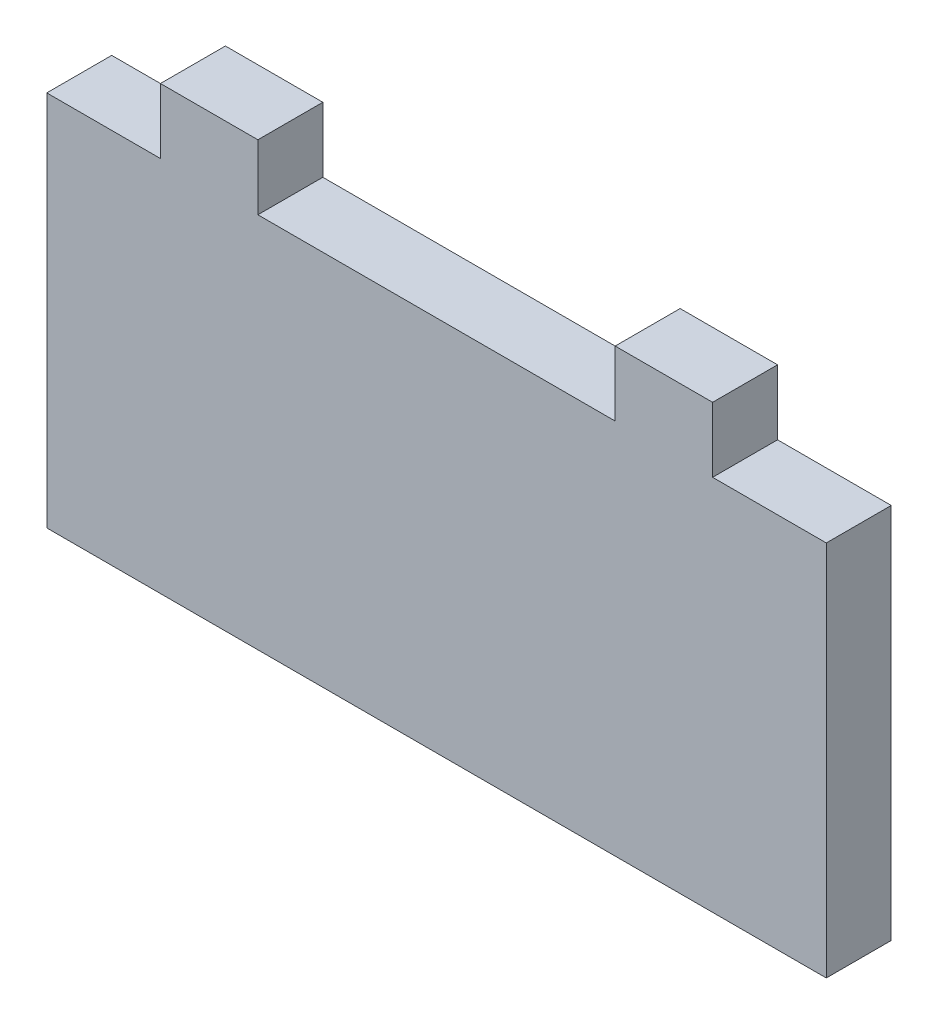
ISO-10303-21;
HEADER;
FILE_DESCRIPTION(('STEP AP214'),'2;1');
FILE_NAME('part.step','',(''),(''),'','','');
FILE_SCHEMA(('AUTOMOTIVE_DESIGN { 1 0 10303 214 1 1 1 1 }'));
ENDSEC;
DATA;
#1=APPLICATION_CONTEXT('core data for automotive mechanical design processes');
#2=APPLICATION_PROTOCOL_DEFINITION('international standard','automotive_design',2000,#1);
#3=PRODUCT_CONTEXT('',#1,'mechanical');
#4=PRODUCT('Part','Part','',(#3));
#5=PRODUCT_RELATED_PRODUCT_CATEGORY('part','',(#4));
#6=PRODUCT_DEFINITION_FORMATION('','',#4);
#7=PRODUCT_DEFINITION_CONTEXT('part definition',#1,'design');
#8=PRODUCT_DEFINITION('design','',#6,#7);
#9=PRODUCT_DEFINITION_SHAPE('','',#8);
#10=(LENGTH_UNIT() NAMED_UNIT(*) SI_UNIT(.MILLI.,.METRE.));
#11=(NAMED_UNIT(*) PLANE_ANGLE_UNIT() SI_UNIT($,.RADIAN.));
#12=(NAMED_UNIT(*) SI_UNIT($,.STERADIAN.) SOLID_ANGLE_UNIT());
#13=UNCERTAINTY_MEASURE_WITH_UNIT(LENGTH_MEASURE(1.E-05),#10,'distance_accuracy_value','');
#14=(GEOMETRIC_REPRESENTATION_CONTEXT(3) GLOBAL_UNCERTAINTY_ASSIGNED_CONTEXT((#13)) GLOBAL_UNIT_ASSIGNED_CONTEXT((#10,
#11,#12)) REPRESENTATION_CONTEXT('',''));
#15=CARTESIAN_POINT('',(0.,0.,0.));
#16=DIRECTION('',(0.,0.,1.));
#17=DIRECTION('',(1.,0.,0.));
#18=AXIS2_PLACEMENT_3D('',#15,#16,#17);
#19=CARTESIAN_POINT('',(-76.2,215.9,-12.7));
#20=DIRECTION('',(-1.,0.,0.));
#21=DIRECTION('',(0.,-1.,0.));
#22=AXIS2_PLACEMENT_3D('',#19,#20,#21);
#23=PLANE('',#22);
#24=DIRECTION('',(0.,-1.,0.));
#25=VECTOR('',#24,1.);
#26=CARTESIAN_POINT('',(-76.2,215.9,0.));
#27=LINE('',#26,#25);
#28=CARTESIAN_POINT('',(-76.2,215.9,0.));
#29=VERTEX_POINT('',#28);
#30=CARTESIAN_POINT('',(-76.2,142.24,0.));
#31=VERTEX_POINT('',#30);
#32=EDGE_CURVE('E152',#29,#31,#27,.T.);
#33=ORIENTED_EDGE('',*,*,#32,.F.);
#34=DIRECTION('',(0.,0.,1.));
#35=VECTOR('',#34,1.);
#36=CARTESIAN_POINT('',(-76.2,215.9,-12.7));
#37=LINE('',#36,#35);
#38=CARTESIAN_POINT('',(-76.2,215.9,-12.7));
#39=VERTEX_POINT('',#38);
#40=EDGE_CURVE('E11',#39,#29,#37,.T.);
#41=ORIENTED_EDGE('',*,*,#40,.F.);
#42=DIRECTION('',(0.,-1.,0.));
#43=VECTOR('',#42,1.);
#44=CARTESIAN_POINT('',(-76.2,215.9,-12.7));
#45=LINE('',#44,#43);
#46=CARTESIAN_POINT('',(-76.2,142.24,-12.7));
#47=VERTEX_POINT('',#46);
#48=EDGE_CURVE('E184',#39,#47,#45,.T.);
#49=ORIENTED_EDGE('',*,*,#48,.T.);
#50=DIRECTION('',(0.,0.,1.));
#51=VECTOR('',#50,1.);
#52=CARTESIAN_POINT('',(-76.2,142.24,-12.7));
#53=LINE('',#52,#51);
#54=EDGE_CURVE('E34',#47,#31,#53,.T.);
#55=ORIENTED_EDGE('',*,*,#54,.T.);
#56=EDGE_LOOP('',(#33,#41,#49,#55));
#57=FACE_BOUND('',#56,.T.);
#58=ADVANCED_FACE('F31',(#57),#23,.T.);
#59=CARTESIAN_POINT('',(-76.2,215.9,-12.7));
#60=DIRECTION('',(0.,1.,0.));
#61=DIRECTION('',(0.,0.,1.));
#62=AXIS2_PLACEMENT_3D('',#59,#60,#61);
#63=PLANE('',#62);
#64=DIRECTION('',(-1.,0.,0.));
#65=VECTOR('',#64,1.);
#66=CARTESIAN_POINT('',(-76.2,215.9,0.));
#67=LINE('',#66,#65);
#68=CARTESIAN_POINT('',(-53.9750000000001,215.9,0.));
#69=VERTEX_POINT('',#68);
#70=EDGE_CURVE('E182',#69,#29,#67,.T.);
#71=ORIENTED_EDGE('',*,*,#70,.F.);
#72=DIRECTION('',(0.,0.,1.));
#73=VECTOR('',#72,1.);
#74=CARTESIAN_POINT('',(-53.9750000000001,215.9,-12.7));
#75=LINE('',#74,#73);
#76=CARTESIAN_POINT('',(-53.9750000000001,215.9,-12.7));
#77=VERTEX_POINT('',#76);
#78=EDGE_CURVE('E40',#77,#69,#75,.T.);
#79=ORIENTED_EDGE('',*,*,#78,.F.);
#80=DIRECTION('',(-1.,0.,0.));
#81=VECTOR('',#80,1.);
#82=CARTESIAN_POINT('',(-76.2,215.9,-12.7));
#83=LINE('',#82,#81);
#84=EDGE_CURVE('E142',#77,#39,#83,.T.);
#85=ORIENTED_EDGE('',*,*,#84,.T.);
#86=ORIENTED_EDGE('',*,*,#40,.T.);
#87=EDGE_LOOP('',(#71,#79,#85,#86));
#88=FACE_BOUND('',#87,.T.);
#89=ADVANCED_FACE('F204',(#88),#63,.T.);
#90=CARTESIAN_POINT('',(-53.9750000000001,215.9,-12.7));
#91=DIRECTION('',(-1.,0.,0.));
#92=DIRECTION('',(0.,-1.,0.));
#93=AXIS2_PLACEMENT_3D('',#90,#91,#92);
#94=PLANE('',#93);
#95=DIRECTION('',(0.,-1.,0.));
#96=VECTOR('',#95,1.);
#97=CARTESIAN_POINT('',(-53.9750000000001,215.9,0.));
#98=LINE('',#97,#96);
#99=CARTESIAN_POINT('',(-53.9750000000001,228.6,0.));
#100=VERTEX_POINT('',#99);
#101=EDGE_CURVE('E129',#100,#69,#98,.T.);
#102=ORIENTED_EDGE('',*,*,#101,.F.);
#103=DIRECTION('',(0.,0.,1.));
#104=VECTOR('',#103,1.);
#105=CARTESIAN_POINT('',(-53.9750000000001,228.6,-12.7));
#106=LINE('',#105,#104);
#107=CARTESIAN_POINT('',(-53.9750000000001,228.6,-12.7));
#108=VERTEX_POINT('',#107);
#109=EDGE_CURVE('E124',#108,#100,#106,.T.);
#110=ORIENTED_EDGE('',*,*,#109,.F.);
#111=DIRECTION('',(0.,-1.,0.));
#112=VECTOR('',#111,1.);
#113=CARTESIAN_POINT('',(-53.9750000000001,215.9,-12.7));
#114=LINE('',#113,#112);
#115=EDGE_CURVE('E127',#108,#77,#114,.T.);
#116=ORIENTED_EDGE('',*,*,#115,.T.);
#117=ORIENTED_EDGE('',*,*,#78,.T.);
#118=EDGE_LOOP('',(#102,#110,#116,#117));
#119=FACE_BOUND('',#118,.T.);
#120=ADVANCED_FACE('F126',(#119),#94,.T.);
#121=CARTESIAN_POINT('',(-34.9250000000001,228.6,-12.7));
#122=DIRECTION('',(0.,1.,0.));
#123=DIRECTION('',(0.,0.,1.));
#124=AXIS2_PLACEMENT_3D('',#121,#122,#123);
#125=PLANE('',#124);
#126=DIRECTION('',(-1.,0.,0.));
#127=VECTOR('',#126,1.);
#128=CARTESIAN_POINT('',(-34.9250000000001,228.6,0.));
#129=LINE('',#128,#127);
#130=CARTESIAN_POINT('',(-34.9250000000001,228.6,0.));
#131=VERTEX_POINT('',#130);
#132=EDGE_CURVE('E179',#131,#100,#129,.T.);
#133=ORIENTED_EDGE('',*,*,#132,.F.);
#134=DIRECTION('',(0.,0.,1.));
#135=VECTOR('',#134,1.);
#136=CARTESIAN_POINT('',(-34.9250000000001,228.6,-12.7));
#137=LINE('',#136,#135);
#138=CARTESIAN_POINT('',(-34.9250000000001,228.6,-12.7));
#139=VERTEX_POINT('',#138);
#140=EDGE_CURVE('E134',#139,#131,#137,.T.);
#141=ORIENTED_EDGE('',*,*,#140,.F.);
#142=DIRECTION('',(-1.,0.,0.));
#143=VECTOR('',#142,1.);
#144=CARTESIAN_POINT('',(-34.9250000000001,228.6,-12.7));
#145=LINE('',#144,#143);
#146=EDGE_CURVE('E140',#139,#108,#145,.T.);
#147=ORIENTED_EDGE('',*,*,#146,.T.);
#148=ORIENTED_EDGE('',*,*,#109,.T.);
#149=EDGE_LOOP('',(#133,#141,#147,#148));
#150=FACE_BOUND('',#149,.T.);
#151=ADVANCED_FACE('F144',(#150),#125,.T.);
#152=CARTESIAN_POINT('',(-34.9250000000001,215.9,-12.7));
#153=DIRECTION('',(1.,0.,0.));
#154=DIRECTION('',(0.,0.,-1.));
#155=AXIS2_PLACEMENT_3D('',#152,#153,#154);
#156=PLANE('',#155);
#157=DIRECTION('',(0.,1.,0.));
#158=VECTOR('',#157,1.);
#159=CARTESIAN_POINT('',(-34.9250000000001,215.9,0.));
#160=LINE('',#159,#158);
#161=CARTESIAN_POINT('',(-34.9250000000001,215.9,0.));
#162=VERTEX_POINT('',#161);
#163=EDGE_CURVE('E176',#162,#131,#160,.T.);
#164=ORIENTED_EDGE('',*,*,#163,.F.);
#165=DIRECTION('',(0.,0.,1.));
#166=VECTOR('',#165,1.);
#167=CARTESIAN_POINT('',(-34.9250000000001,215.9,-12.7));
#168=LINE('',#167,#166);
#169=CARTESIAN_POINT('',(-34.9250000000001,215.9,-12.7));
#170=VERTEX_POINT('',#169);
#171=EDGE_CURVE('E188',#170,#162,#168,.T.);
#172=ORIENTED_EDGE('',*,*,#171,.F.);
#173=DIRECTION('',(0.,1.,0.));
#174=VECTOR('',#173,1.);
#175=CARTESIAN_POINT('',(-34.9250000000001,215.9,-12.7));
#176=LINE('',#175,#174);
#177=EDGE_CURVE('E145',#170,#139,#176,.T.);
#178=ORIENTED_EDGE('',*,*,#177,.T.);
#179=ORIENTED_EDGE('',*,*,#140,.T.);
#180=EDGE_LOOP('',(#164,#172,#178,#179));
#181=FACE_BOUND('',#180,.T.);
#182=ADVANCED_FACE('F217',(#181),#156,.T.);
#183=CARTESIAN_POINT('',(-34.9250000000001,215.9,-12.7));
#184=DIRECTION('',(0.,1.,0.));
#185=DIRECTION('',(0.,0.,1.));
#186=AXIS2_PLACEMENT_3D('',#183,#184,#185);
#187=PLANE('',#186);
#188=DIRECTION('',(-1.,0.,0.));
#189=VECTOR('',#188,1.);
#190=CARTESIAN_POINT('',(-34.9250000000001,215.9,0.));
#191=LINE('',#190,#189);
#192=CARTESIAN_POINT('',(34.9249999999999,215.9,0.));
#193=VERTEX_POINT('',#192);
#194=EDGE_CURVE('E173',#193,#162,#191,.T.);
#195=ORIENTED_EDGE('',*,*,#194,.F.);
#196=DIRECTION('',(0.,0.,1.));
#197=VECTOR('',#196,1.);
#198=CARTESIAN_POINT('',(34.9249999999999,215.9,-12.7));
#199=LINE('',#198,#197);
#200=CARTESIAN_POINT('',(34.9249999999999,215.9,-12.7));
#201=VERTEX_POINT('',#200);
#202=EDGE_CURVE('E190',#201,#193,#199,.T.);
#203=ORIENTED_EDGE('',*,*,#202,.F.);
#204=DIRECTION('',(-1.,0.,0.));
#205=VECTOR('',#204,1.);
#206=CARTESIAN_POINT('',(-34.9250000000001,215.9,-12.7));
#207=LINE('',#206,#205);
#208=EDGE_CURVE('E147',#201,#170,#207,.T.);
#209=ORIENTED_EDGE('',*,*,#208,.T.);
#210=ORIENTED_EDGE('',*,*,#171,.T.);
#211=EDGE_LOOP('',(#195,#203,#209,#210));
#212=FACE_BOUND('',#211,.T.);
#213=ADVANCED_FACE('F220',(#212),#187,.T.);
#214=CARTESIAN_POINT('',(34.9249999999999,215.9,-12.7));
#215=DIRECTION('',(-1.,0.,0.));
#216=DIRECTION('',(0.,0.,1.));
#217=AXIS2_PLACEMENT_3D('',#214,#215,#216);
#218=PLANE('',#217);
#219=DIRECTION('',(0.,-1.,0.));
#220=VECTOR('',#219,1.);
#221=CARTESIAN_POINT('',(34.9249999999999,215.9,0.));
#222=LINE('',#221,#220);
#223=CARTESIAN_POINT('',(34.9249999999999,228.6,0.));
#224=VERTEX_POINT('',#223);
#225=EDGE_CURVE('E170',#224,#193,#222,.T.);
#226=ORIENTED_EDGE('',*,*,#225,.F.);
#227=DIRECTION('',(0.,0.,1.));
#228=VECTOR('',#227,1.);
#229=CARTESIAN_POINT('',(34.9249999999999,228.6,-12.7));
#230=LINE('',#229,#228);
#231=CARTESIAN_POINT('',(34.9249999999999,228.6,-12.7));
#232=VERTEX_POINT('',#231);
#233=EDGE_CURVE('E192',#232,#224,#230,.T.);
#234=ORIENTED_EDGE('',*,*,#233,.F.);
#235=DIRECTION('',(0.,-1.,0.));
#236=VECTOR('',#235,1.);
#237=CARTESIAN_POINT('',(34.9249999999999,215.9,-12.7));
#238=LINE('',#237,#236);
#239=EDGE_CURVE('E346',#232,#201,#238,.T.);
#240=ORIENTED_EDGE('',*,*,#239,.T.);
#241=ORIENTED_EDGE('',*,*,#202,.T.);
#242=EDGE_LOOP('',(#226,#234,#240,#241));
#243=FACE_BOUND('',#242,.T.);
#244=ADVANCED_FACE('F224',(#243),#218,.T.);
#245=CARTESIAN_POINT('',(53.9749999999999,228.6,-12.7));
#246=DIRECTION('',(0.,1.,0.));
#247=DIRECTION('',(0.,0.,1.));
#248=AXIS2_PLACEMENT_3D('',#245,#246,#247);
#249=PLANE('',#248);
#250=DIRECTION('',(-1.,0.,0.));
#251=VECTOR('',#250,1.);
#252=CARTESIAN_POINT('',(53.9749999999999,228.6,0.));
#253=LINE('',#252,#251);
#254=CARTESIAN_POINT('',(53.9749999999999,228.6,0.));
#255=VERTEX_POINT('',#254);
#256=EDGE_CURVE('E167',#255,#224,#253,.T.);
#257=ORIENTED_EDGE('',*,*,#256,.F.);
#258=DIRECTION('',(0.,0.,1.));
#259=VECTOR('',#258,1.);
#260=CARTESIAN_POINT('',(53.9749999999999,228.6,-12.7));
#261=LINE('',#260,#259);
#262=CARTESIAN_POINT('',(53.9749999999999,228.6,-12.7));
#263=VERTEX_POINT('',#262);
#264=EDGE_CURVE('E194',#263,#255,#261,.T.);
#265=ORIENTED_EDGE('',*,*,#264,.F.);
#266=DIRECTION('',(-1.,0.,0.));
#267=VECTOR('',#266,1.);
#268=CARTESIAN_POINT('',(53.9749999999999,228.6,-12.7));
#269=LINE('',#268,#267);
#270=EDGE_CURVE('E350',#263,#232,#269,.T.);
#271=ORIENTED_EDGE('',*,*,#270,.T.);
#272=ORIENTED_EDGE('',*,*,#233,.T.);
#273=EDGE_LOOP('',(#257,#265,#271,#272));
#274=FACE_BOUND('',#273,.T.);
#275=ADVANCED_FACE('F228',(#274),#249,.T.);
#276=CARTESIAN_POINT('',(53.9749999999999,215.9,-12.7));
#277=DIRECTION('',(1.,0.,0.));
#278=DIRECTION('',(0.,0.,-1.));
#279=AXIS2_PLACEMENT_3D('',#276,#277,#278);
#280=PLANE('',#279);
#281=DIRECTION('',(0.,1.,0.));
#282=VECTOR('',#281,1.);
#283=CARTESIAN_POINT('',(53.9749999999999,215.9,0.));
#284=LINE('',#283,#282);
#285=CARTESIAN_POINT('',(53.9749999999999,215.9,0.));
#286=VERTEX_POINT('',#285);
#287=EDGE_CURVE('E164',#286,#255,#284,.T.);
#288=ORIENTED_EDGE('',*,*,#287,.F.);
#289=DIRECTION('',(0.,0.,1.));
#290=VECTOR('',#289,1.);
#291=CARTESIAN_POINT('',(53.9749999999999,215.9,-12.7));
#292=LINE('',#291,#290);
#293=CARTESIAN_POINT('',(53.9749999999999,215.9,-12.7));
#294=VERTEX_POINT('',#293);
#295=EDGE_CURVE('E196',#294,#286,#292,.T.);
#296=ORIENTED_EDGE('',*,*,#295,.F.);
#297=DIRECTION('',(0.,1.,0.));
#298=VECTOR('',#297,1.);
#299=CARTESIAN_POINT('',(53.9749999999999,215.9,-12.7));
#300=LINE('',#299,#298);
#301=EDGE_CURVE('E339',#294,#263,#300,.T.);
#302=ORIENTED_EDGE('',*,*,#301,.T.);
#303=ORIENTED_EDGE('',*,*,#264,.T.);
#304=EDGE_LOOP('',(#288,#296,#302,#303));
#305=FACE_BOUND('',#304,.T.);
#306=ADVANCED_FACE('F232',(#305),#280,.T.);
#307=CARTESIAN_POINT('',(53.9749999999999,215.9,-12.7));
#308=DIRECTION('',(0.,1.,0.));
#309=DIRECTION('',(-1.,0.,0.));
#310=AXIS2_PLACEMENT_3D('',#307,#308,#309);
#311=PLANE('',#310);
#312=DIRECTION('',(-1.,0.,0.));
#313=VECTOR('',#312,1.);
#314=CARTESIAN_POINT('',(53.9749999999999,215.9,0.));
#315=LINE('',#314,#313);
#316=CARTESIAN_POINT('',(76.2,215.9,0.));
#317=VERTEX_POINT('',#316);
#318=EDGE_CURVE('E161',#317,#286,#315,.T.);
#319=ORIENTED_EDGE('',*,*,#318,.F.);
#320=DIRECTION('',(0.,0.,1.));
#321=VECTOR('',#320,1.);
#322=CARTESIAN_POINT('',(76.2,215.9,-12.7));
#323=LINE('',#322,#321);
#324=CARTESIAN_POINT('',(76.2,215.9,-12.7));
#325=VERTEX_POINT('',#324);
#326=EDGE_CURVE('E198',#325,#317,#323,.T.);
#327=ORIENTED_EDGE('',*,*,#326,.F.);
#328=DIRECTION('',(-1.,0.,0.));
#329=VECTOR('',#328,1.);
#330=CARTESIAN_POINT('',(53.9749999999999,215.9,-12.7));
#331=LINE('',#330,#329);
#332=EDGE_CURVE('E335',#325,#294,#331,.T.);
#333=ORIENTED_EDGE('',*,*,#332,.T.);
#334=ORIENTED_EDGE('',*,*,#295,.T.);
#335=EDGE_LOOP('',(#319,#327,#333,#334));
#336=FACE_BOUND('',#335,.T.);
#337=ADVANCED_FACE('F236',(#336),#311,.T.);
#338=CARTESIAN_POINT('',(76.2,215.9,-12.7));
#339=DIRECTION('',(1.,0.,0.));
#340=DIRECTION('',(0.,1.,0.));
#341=AXIS2_PLACEMENT_3D('',#338,#339,#340);
#342=PLANE('',#341);
#343=DIRECTION('',(0.,1.,0.));
#344=VECTOR('',#343,1.);
#345=CARTESIAN_POINT('',(76.2,215.9,0.));
#346=LINE('',#345,#344);
#347=CARTESIAN_POINT('',(76.1999999999999,142.24,0.));
#348=VERTEX_POINT('',#347);
#349=EDGE_CURVE('E158',#348,#317,#346,.T.);
#350=ORIENTED_EDGE('',*,*,#349,.F.);
#351=DIRECTION('',(0.,0.,1.));
#352=VECTOR('',#351,1.);
#353=CARTESIAN_POINT('',(76.1999999999999,142.24,-12.7));
#354=LINE('',#353,#352);
#355=CARTESIAN_POINT('',(76.1999999999999,142.24,-12.7));
#356=VERTEX_POINT('',#355);
#357=EDGE_CURVE('E199',#356,#348,#354,.T.);
#358=ORIENTED_EDGE('',*,*,#357,.F.);
#359=DIRECTION('',(0.,1.,0.));
#360=VECTOR('',#359,1.);
#361=CARTESIAN_POINT('',(76.2,215.9,-12.7));
#362=LINE('',#361,#360);
#363=EDGE_CURVE('E356',#356,#325,#362,.T.);
#364=ORIENTED_EDGE('',*,*,#363,.T.);
#365=ORIENTED_EDGE('',*,*,#326,.T.);
#366=EDGE_LOOP('',(#350,#358,#364,#365));
#367=FACE_BOUND('',#366,.T.);
#368=ADVANCED_FACE('F240',(#367),#342,.T.);
#369=CARTESIAN_POINT('',(-76.2,142.24,-12.7));
#370=DIRECTION('',(0.,-1.,0.));
#371=DIRECTION('',(0.,0.,-1.));
#372=AXIS2_PLACEMENT_3D('',#369,#370,#371);
#373=PLANE('',#372);
#374=DIRECTION('',(1.,0.,0.));
#375=VECTOR('',#374,1.);
#376=CARTESIAN_POINT('',(-76.2,142.24,0.));
#377=LINE('',#376,#375);
#378=EDGE_CURVE('E155',#31,#348,#377,.T.);
#379=ORIENTED_EDGE('',*,*,#378,.F.);
#380=ORIENTED_EDGE('',*,*,#54,.F.);
#381=DIRECTION('',(1.,0.,0.));
#382=VECTOR('',#381,1.);
#383=CARTESIAN_POINT('',(-76.2,142.24,-12.7));
#384=LINE('',#383,#382);
#385=EDGE_CURVE('E358',#47,#356,#384,.T.);
#386=ORIENTED_EDGE('',*,*,#385,.T.);
#387=ORIENTED_EDGE('',*,*,#357,.T.);
#388=EDGE_LOOP('',(#379,#380,#386,#387));
#389=FACE_BOUND('',#388,.T.);
#390=ADVANCED_FACE('F201',(#389),#373,.T.);
#391=CARTESIAN_POINT('',(-76.2,142.24,-12.7));
#392=DIRECTION('',(0.,0.,1.));
#393=DIRECTION('',(1.,0.,0.));
#394=AXIS2_PLACEMENT_3D('',#391,#392,#393);
#395=PLANE('',#394);
#396=ORIENTED_EDGE('',*,*,#48,.F.);
#397=ORIENTED_EDGE('',*,*,#84,.F.);
#398=ORIENTED_EDGE('',*,*,#115,.F.);
#399=ORIENTED_EDGE('',*,*,#146,.F.);
#400=ORIENTED_EDGE('',*,*,#177,.F.);
#401=ORIENTED_EDGE('',*,*,#208,.F.);
#402=ORIENTED_EDGE('',*,*,#239,.F.);
#403=ORIENTED_EDGE('',*,*,#270,.F.);
#404=ORIENTED_EDGE('',*,*,#301,.F.);
#405=ORIENTED_EDGE('',*,*,#332,.F.);
#406=ORIENTED_EDGE('',*,*,#363,.F.);
#407=ORIENTED_EDGE('',*,*,#385,.F.);
#408=EDGE_LOOP('',(#396,#397,#398,#399,#400,#401,#402,#403,#404,#405,#406,#407));
#409=FACE_BOUND('',#408,.T.);
#410=ADVANCED_FACE('F138',(#409),#395,.F.);
#411=CARTESIAN_POINT('',(-76.2,142.24,0.));
#412=DIRECTION('',(0.,0.,1.));
#413=DIRECTION('',(1.,0.,0.));
#414=AXIS2_PLACEMENT_3D('',#411,#412,#413);
#415=PLANE('',#414);
#416=ORIENTED_EDGE('',*,*,#32,.T.);
#417=ORIENTED_EDGE('',*,*,#378,.T.);
#418=ORIENTED_EDGE('',*,*,#349,.T.);
#419=ORIENTED_EDGE('',*,*,#318,.T.);
#420=ORIENTED_EDGE('',*,*,#287,.T.);
#421=ORIENTED_EDGE('',*,*,#256,.T.);
#422=ORIENTED_EDGE('',*,*,#225,.T.);
#423=ORIENTED_EDGE('',*,*,#194,.T.);
#424=ORIENTED_EDGE('',*,*,#163,.T.);
#425=ORIENTED_EDGE('',*,*,#132,.T.);
#426=ORIENTED_EDGE('',*,*,#101,.T.);
#427=ORIENTED_EDGE('',*,*,#70,.T.);
#428=EDGE_LOOP('',(#416,#417,#418,#419,#420,#421,#422,#423,#424,#425,#426,#427));
#429=FACE_BOUND('',#428,.T.);
#430=ADVANCED_FACE('F203',(#429),#415,.T.);
#431=CLOSED_SHELL('',(#58,#89,#120,#151,#182,#213,#244,#275,#306,#337,#368,#390,#410,#430));
#432=MANIFOLD_SOLID_BREP('B2',#431);
#433=ADVANCED_BREP_SHAPE_REPRESENTATION('',(#18,#432),#14);
#434=SHAPE_DEFINITION_REPRESENTATION(#9,#433);
ENDSEC;
END-ISO-10303-21;
